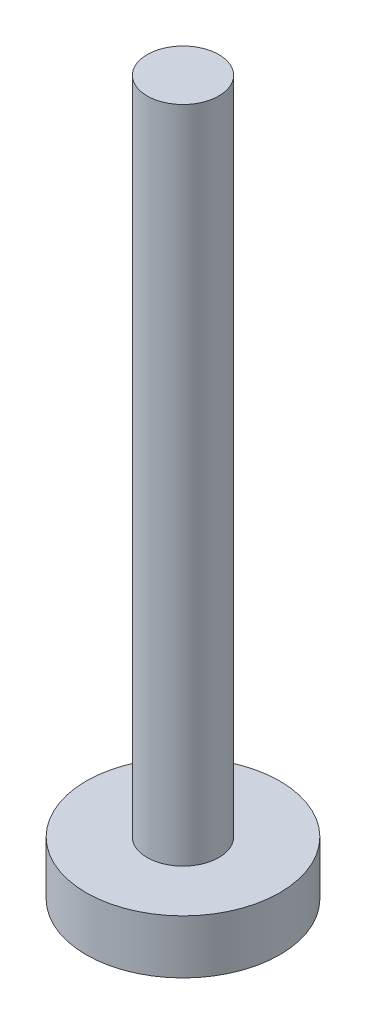
ISO-10303-21;
HEADER;
FILE_DESCRIPTION(('STEP AP214'),'2;1');
FILE_NAME('part.step','',(''),(''),'','','');
FILE_SCHEMA(('AUTOMOTIVE_DESIGN { 1 0 10303 214 1 1 1 1 }'));
ENDSEC;
DATA;
#1=APPLICATION_CONTEXT('core data for automotive mechanical design processes');
#2=APPLICATION_PROTOCOL_DEFINITION('international standard','automotive_design',2000,#1);
#3=PRODUCT_CONTEXT('',#1,'mechanical');
#4=PRODUCT('Part','Part','',(#3));
#5=PRODUCT_RELATED_PRODUCT_CATEGORY('part','',(#4));
#6=PRODUCT_DEFINITION_FORMATION('','',#4);
#7=PRODUCT_DEFINITION_CONTEXT('part definition',#1,'design');
#8=PRODUCT_DEFINITION('design','',#6,#7);
#9=PRODUCT_DEFINITION_SHAPE('','',#8);
#10=(LENGTH_UNIT() NAMED_UNIT(*) SI_UNIT(.MILLI.,.METRE.));
#11=(NAMED_UNIT(*) PLANE_ANGLE_UNIT() SI_UNIT($,.RADIAN.));
#12=(NAMED_UNIT(*) SI_UNIT($,.STERADIAN.) SOLID_ANGLE_UNIT());
#13=UNCERTAINTY_MEASURE_WITH_UNIT(LENGTH_MEASURE(1.E-05),#10,'distance_accuracy_value','');
#14=(GEOMETRIC_REPRESENTATION_CONTEXT(3) GLOBAL_UNCERTAINTY_ASSIGNED_CONTEXT((#13)) GLOBAL_UNIT_ASSIGNED_CONTEXT((#10,
#11,#12)) REPRESENTATION_CONTEXT('',''));
#15=CARTESIAN_POINT('',(0.,0.,0.));
#16=DIRECTION('',(0.,0.,1.));
#17=DIRECTION('',(1.,0.,0.));
#18=AXIS2_PLACEMENT_3D('',#15,#16,#17);
#19=CARTESIAN_POINT('',(0.,3.81,0.));
#20=DIRECTION('',(0.,-1.,0.));
#21=DIRECTION('',(0.,0.,-1.));
#22=AXIS2_PLACEMENT_3D('',#19,#20,#21);
#23=CYLINDRICAL_SURFACE('',#22,6.858);
#24=CARTESIAN_POINT('',(0.,3.81,0.));
#25=DIRECTION('',(0.,1.,0.));
#26=DIRECTION('',(0.,0.,1.));
#27=AXIS2_PLACEMENT_3D('',#24,#25,#26);
#28=CIRCLE('',#27,6.858);
#29=CARTESIAN_POINT('',(0.,3.81,-6.858));
#30=VERTEX_POINT('',#29);
#31=EDGE_CURVE('E51',#30,#30,#28,.T.);
#32=CARTESIAN_POINT('',(0.,0.,0.));
#33=DIRECTION('',(0.,1.,0.));
#34=DIRECTION('',(0.,0.,1.));
#35=AXIS2_PLACEMENT_3D('',#32,#33,#34);
#36=CIRCLE('',#35,6.858);
#37=CARTESIAN_POINT('',(0.,0.,-6.858));
#38=VERTEX_POINT('',#37);
#39=EDGE_CURVE('E46',#38,#38,#36,.T.);
#40=CARTESIAN_POINT('',(0.,3.81,-6.858));
#41=CARTESIAN_POINT('',(0.,3.7703125,-6.858));
#42=CARTESIAN_POINT('',(0.,3.730625,-6.858));
#43=CARTESIAN_POINT('',(0.,3.65125,-6.858));
#44=CARTESIAN_POINT('',(0.,3.6115625,-6.858));
#45=CARTESIAN_POINT('',(0.,3.5321875,-6.858));
#46=CARTESIAN_POINT('',(0.,3.4925,-6.858));
#47=CARTESIAN_POINT('',(0.,3.413125,-6.858));
#48=CARTESIAN_POINT('',(0.,3.3734375,-6.858));
#49=CARTESIAN_POINT('',(0.,3.2940625,-6.858));
#50=CARTESIAN_POINT('',(0.,3.254375,-6.858));
#51=CARTESIAN_POINT('',(0.,3.175,-6.858));
#52=CARTESIAN_POINT('',(0.,3.1353125,-6.858));
#53=CARTESIAN_POINT('',(0.,3.0559375,-6.858));
#54=CARTESIAN_POINT('',(0.,3.01625,-6.858));
#55=CARTESIAN_POINT('',(0.,2.936875,-6.858));
#56=CARTESIAN_POINT('',(0.,2.8971875,-6.858));
#57=CARTESIAN_POINT('',(0.,2.8178125,-6.858));
#58=CARTESIAN_POINT('',(0.,2.778125,-6.858));
#59=CARTESIAN_POINT('',(0.,2.69875,-6.858));
#60=CARTESIAN_POINT('',(0.,2.6590625,-6.858));
#61=CARTESIAN_POINT('',(0.,2.5796875,-6.858));
#62=CARTESIAN_POINT('',(0.,2.54,-6.858));
#63=CARTESIAN_POINT('',(0.,2.460625,-6.858));
#64=CARTESIAN_POINT('',(0.,2.4209375,-6.858));
#65=CARTESIAN_POINT('',(0.,2.3415625,-6.858));
#66=CARTESIAN_POINT('',(0.,2.301875,-6.858));
#67=CARTESIAN_POINT('',(0.,2.2225,-6.858));
#68=CARTESIAN_POINT('',(0.,2.1828125,-6.858));
#69=CARTESIAN_POINT('',(0.,2.1034375,-6.858));
#70=CARTESIAN_POINT('',(0.,2.06375,-6.858));
#71=CARTESIAN_POINT('',(0.,1.984375,-6.858));
#72=CARTESIAN_POINT('',(0.,1.9446875,-6.858));
#73=CARTESIAN_POINT('',(0.,1.8653125,-6.858));
#74=CARTESIAN_POINT('',(0.,1.825625,-6.858));
#75=CARTESIAN_POINT('',(0.,1.74625,-6.858));
#76=CARTESIAN_POINT('',(0.,1.7065625,-6.858));
#77=CARTESIAN_POINT('',(0.,1.6271875,-6.858));
#78=CARTESIAN_POINT('',(0.,1.5875,-6.858));
#79=CARTESIAN_POINT('',(0.,1.508125,-6.858));
#80=CARTESIAN_POINT('',(0.,1.4684375,-6.858));
#81=CARTESIAN_POINT('',(0.,1.3890625,-6.858));
#82=CARTESIAN_POINT('',(0.,1.349375,-6.858));
#83=CARTESIAN_POINT('',(0.,1.27,-6.858));
#84=CARTESIAN_POINT('',(0.,1.2303125,-6.858));
#85=CARTESIAN_POINT('',(0.,1.1509375,-6.858));
#86=CARTESIAN_POINT('',(0.,1.11125,-6.858));
#87=CARTESIAN_POINT('',(0.,1.031875,-6.858));
#88=CARTESIAN_POINT('',(0.,0.9921875,-6.858));
#89=CARTESIAN_POINT('',(0.,0.9128125,-6.858));
#90=CARTESIAN_POINT('',(0.,0.873125,-6.858));
#91=CARTESIAN_POINT('',(0.,0.79375,-6.858));
#92=CARTESIAN_POINT('',(0.,0.7540625,-6.858));
#93=CARTESIAN_POINT('',(0.,0.6746875,-6.858));
#94=CARTESIAN_POINT('',(0.,0.635,-6.858));
#95=CARTESIAN_POINT('',(0.,0.555625,-6.858));
#96=CARTESIAN_POINT('',(0.,0.5159375,-6.858));
#97=CARTESIAN_POINT('',(0.,0.4365625,-6.858));
#98=CARTESIAN_POINT('',(0.,0.396875,-6.858));
#99=CARTESIAN_POINT('',(0.,0.3175,-6.858));
#100=CARTESIAN_POINT('',(0.,0.2778125,-6.858));
#101=CARTESIAN_POINT('',(0.,0.1984375,-6.858));
#102=CARTESIAN_POINT('',(0.,0.15875,-6.858));
#103=CARTESIAN_POINT('',(0.,0.0793749999999999,-6.858));
#104=CARTESIAN_POINT('',(0.,0.0396874999999999,-6.858));
#105=CARTESIAN_POINT('',(0.,0.,-6.858));
#106=B_SPLINE_CURVE_WITH_KNOTS('',3,(#40,#41,#42,#43,#44,#45,#46,#47,#48,#49,#50,#51,#52,#53,
#54,#55,#56,#57,#58,#59,#60,#61,#62,#63,#64,#65,#66,#67,#68,#69,#70,#71,#72,#73,#74,#75,#76,#77,
#78,#79,#80,#81,#82,#83,#84,#85,#86,#87,#88,#89,#90,#91,#92,#93,#94,#95,#96,#97,#98,#99,#100,
#101,#102,#103,#104,#105),.UNSPECIFIED.,.F.,.F.,(4,2,2,2,2,2,2,2,2,2,2,2,2,2,2,2,2,2,2,2,2,2,2,
2,2,2,2,2,2,2,2,2,4),(0.,0.1190625,0.238125,0.3571875,0.47625,0.5953125,0.714375,0.8334375,
0.9525,1.0715625,1.190625,1.3096875,1.42875,1.5478125,1.666875,1.7859375,1.905,2.0240625,
2.143125,2.2621875,2.38125,2.5003125,2.619375,2.7384375,2.8575,2.9765625,3.095625,3.2146875,
3.33375,3.4528125,3.571875,3.6909375,3.81),.UNSPECIFIED.);
#107=EDGE_CURVE('BSEAM43',#30,#38,#106,.T.);
#108=ORIENTED_EDGE('',*,*,#31,.F.);
#109=ORIENTED_EDGE('',*,*,#39,.T.);
#110=ORIENTED_EDGE('',*,*,#107,.T.);
#111=ORIENTED_EDGE('',*,*,#107,.F.);
#112=EDGE_LOOP('',(#108,#110,#109,#111));
#113=FACE_BOUND('',#112,.T.);
#114=ADVANCED_FACE('F43',(#113),#23,.T.);
#115=CARTESIAN_POINT('',(0.,3.81,0.));
#116=DIRECTION('',(0.,1.,0.));
#117=DIRECTION('',(0.,0.,1.));
#118=AXIS2_PLACEMENT_3D('',#115,#116,#117);
#119=PLANE('',#118);
#120=CARTESIAN_POINT('',(0.,3.81,0.));
#121=DIRECTION('',(0.,1.,0.));
#122=DIRECTION('',(0.,0.,1.));
#123=AXIS2_PLACEMENT_3D('',#120,#121,#122);
#124=CIRCLE('',#123,2.54);
#125=CARTESIAN_POINT('',(0.,3.81,2.54));
#126=VERTEX_POINT('',#125);
#127=EDGE_CURVE('E10',#126,#126,#124,.T.);
#128=ORIENTED_EDGE('',*,*,#127,.F.);
#129=EDGE_LOOP('',(#128));
#130=FACE_BOUND('',#129,.T.);
#131=ORIENTED_EDGE('',*,*,#31,.T.);
#132=EDGE_LOOP('',(#131));
#133=FACE_BOUND('',#132,.T.);
#134=ADVANCED_FACE('F71',(#130,#133),#119,.T.);
#135=CARTESIAN_POINT('',(0.,0.,0.));
#136=DIRECTION('',(0.,1.,0.));
#137=DIRECTION('',(0.,0.,1.));
#138=AXIS2_PLACEMENT_3D('',#135,#136,#137);
#139=PLANE('',#138);
#140=ORIENTED_EDGE('',*,*,#39,.F.);
#141=EDGE_LOOP('',(#140));
#142=FACE_BOUND('',#141,.T.);
#143=ADVANCED_FACE('F68',(#142),#139,.F.);
#144=CARTESIAN_POINT('',(0.,50.546,0.));
#145=DIRECTION('',(0.,-1.,0.));
#146=DIRECTION('',(0.,0.,-1.));
#147=AXIS2_PLACEMENT_3D('',#144,#145,#146);
#148=CYLINDRICAL_SURFACE('',#147,2.54);
#149=CARTESIAN_POINT('',(0.,50.546,0.));
#150=DIRECTION('',(0.,1.,0.));
#151=DIRECTION('',(0.,0.,1.));
#152=AXIS2_PLACEMENT_3D('',#149,#150,#151);
#153=CIRCLE('',#152,2.54);
#154=CARTESIAN_POINT('',(0.,50.546,2.54));
#155=VERTEX_POINT('',#154);
#156=EDGE_CURVE('E58',#155,#155,#153,.T.);
#157=ORIENTED_EDGE('',*,*,#156,.F.);
#158=EDGE_LOOP('',(#157));
#159=FACE_BOUND('',#158,.T.);
#160=ORIENTED_EDGE('',*,*,#127,.T.);
#161=EDGE_LOOP('',(#160));
#162=FACE_BOUND('',#161,.T.);
#163=ADVANCED_FACE('F70',(#159,#162),#148,.T.);
#164=CARTESIAN_POINT('',(0.,50.546,0.));
#165=DIRECTION('',(0.,1.,0.));
#166=DIRECTION('',(0.,0.,1.));
#167=AXIS2_PLACEMENT_3D('',#164,#165,#166);
#168=PLANE('',#167);
#169=ORIENTED_EDGE('',*,*,#156,.T.);
#170=EDGE_LOOP('',(#169));
#171=FACE_BOUND('',#170,.T.);
#172=ADVANCED_FACE('F77',(#171),#168,.T.);
#173=CLOSED_SHELL('',(#114,#134,#143,#163,#172));
#174=MANIFOLD_SOLID_BREP('B2',#173);
#175=ADVANCED_BREP_SHAPE_REPRESENTATION('',(#18,#174),#14);
#176=SHAPE_DEFINITION_REPRESENTATION(#9,#175);
ENDSEC;
END-ISO-10303-21;
